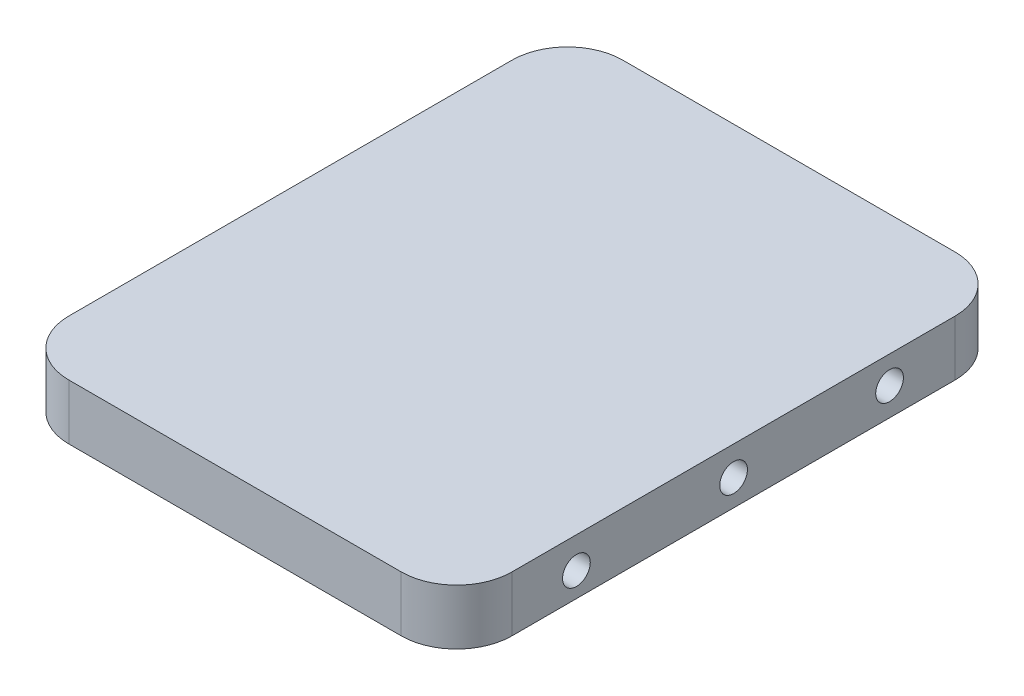
ISO-10303-21;
HEADER;
FILE_DESCRIPTION(('STEP AP214'),'2;1');
FILE_NAME('part.step','',(''),(''),'','','');
FILE_SCHEMA(('AUTOMOTIVE_DESIGN { 1 0 10303 214 1 1 1 1 }'));
ENDSEC;
DATA;
#1=APPLICATION_CONTEXT('core data for automotive mechanical design processes');
#2=APPLICATION_PROTOCOL_DEFINITION('international standard','automotive_design',2000,#1);
#3=PRODUCT_CONTEXT('',#1,'mechanical');
#4=PRODUCT('Part','Part','',(#3));
#5=PRODUCT_RELATED_PRODUCT_CATEGORY('part','',(#4));
#6=PRODUCT_DEFINITION_FORMATION('','',#4);
#7=PRODUCT_DEFINITION_CONTEXT('part definition',#1,'design');
#8=PRODUCT_DEFINITION('design','',#6,#7);
#9=PRODUCT_DEFINITION_SHAPE('','',#8);
#10=(LENGTH_UNIT() NAMED_UNIT(*) SI_UNIT(.MILLI.,.METRE.));
#11=(NAMED_UNIT(*) PLANE_ANGLE_UNIT() SI_UNIT($,.RADIAN.));
#12=(NAMED_UNIT(*) SI_UNIT($,.STERADIAN.) SOLID_ANGLE_UNIT());
#13=UNCERTAINTY_MEASURE_WITH_UNIT(LENGTH_MEASURE(1.E-05),#10,'distance_accuracy_value','');
#14=(GEOMETRIC_REPRESENTATION_CONTEXT(3) GLOBAL_UNCERTAINTY_ASSIGNED_CONTEXT((#13)) GLOBAL_UNIT_ASSIGNED_CONTEXT((#10,
#11,#12)) REPRESENTATION_CONTEXT('',''));
#15=CARTESIAN_POINT('',(0.,0.,0.));
#16=DIRECTION('',(0.,0.,1.));
#17=DIRECTION('',(1.,0.,0.));
#18=AXIS2_PLACEMENT_3D('',#15,#16,#17);
#19=CARTESIAN_POINT('',(-30.,10.,40.));
#20=DIRECTION('',(0.,-1.,0.));
#21=DIRECTION('',(0.,0.,-1.));
#22=AXIS2_PLACEMENT_3D('',#19,#20,#21);
#23=CYLINDRICAL_SURFACE('',#22,10.);
#24=CARTESIAN_POINT('',(-30.,0.,40.));
#25=DIRECTION('',(0.,1.,0.));
#26=DIRECTION('',(0.,0.,1.));
#27=AXIS2_PLACEMENT_3D('',#24,#25,#26);
#28=CIRCLE('',#27,10.);
#29=CARTESIAN_POINT('',(-40.,0.,39.9999999999999));
#30=VERTEX_POINT('',#29);
#31=CARTESIAN_POINT('',(-29.9999999999999,0.,50.));
#32=VERTEX_POINT('',#31);
#33=EDGE_CURVE('E135',#30,#32,#28,.T.);
#34=ORIENTED_EDGE('',*,*,#33,.T.);
#35=DIRECTION('',(0.,-1.,0.));
#36=VECTOR('',#35,1.);
#37=CARTESIAN_POINT('',(-29.9999999999999,10.,50.));
#38=LINE('',#37,#36);
#39=CARTESIAN_POINT('',(-29.9999999999999,10.,50.));
#40=VERTEX_POINT('',#39);
#41=EDGE_CURVE('E11',#40,#32,#38,.T.);
#42=ORIENTED_EDGE('',*,*,#41,.F.);
#43=CARTESIAN_POINT('',(-30.,10.,40.));
#44=DIRECTION('',(0.,1.,0.));
#45=DIRECTION('',(0.,0.,1.));
#46=AXIS2_PLACEMENT_3D('',#43,#44,#45);
#47=CIRCLE('',#46,10.);
#48=CARTESIAN_POINT('',(-40.,10.,39.9999999999999));
#49=VERTEX_POINT('',#48);
#50=EDGE_CURVE('E150',#49,#40,#47,.T.);
#51=ORIENTED_EDGE('',*,*,#50,.F.);
#52=DIRECTION('',(0.,-1.,0.));
#53=VECTOR('',#52,1.);
#54=CARTESIAN_POINT('',(-40.,10.,39.9999999999999));
#55=LINE('',#54,#53);
#56=EDGE_CURVE('E131',#49,#30,#55,.T.);
#57=ORIENTED_EDGE('',*,*,#56,.T.);
#58=EDGE_LOOP('',(#34,#42,#51,#57));
#59=FACE_BOUND('',#58,.T.);
#60=ADVANCED_FACE('F39',(#59),#23,.T.);
#61=CARTESIAN_POINT('',(-29.9999999999999,10.,50.));
#62=DIRECTION('',(0.,0.,-1.));
#63=DIRECTION('',(-1.,0.,0.));
#64=AXIS2_PLACEMENT_3D('',#61,#62,#63);
#65=PLANE('',#64);
#66=DIRECTION('',(1.,0.,0.));
#67=VECTOR('',#66,1.);
#68=CARTESIAN_POINT('',(-29.9999999999999,0.,50.));
#69=LINE('',#68,#67);
#70=CARTESIAN_POINT('',(29.9999999999999,0.,50.));
#71=VERTEX_POINT('',#70);
#72=EDGE_CURVE('E138',#32,#71,#69,.T.);
#73=ORIENTED_EDGE('',*,*,#72,.T.);
#74=DIRECTION('',(0.,-1.,0.));
#75=VECTOR('',#74,1.);
#76=CARTESIAN_POINT('',(29.9999999999999,10.,50.));
#77=LINE('',#76,#75);
#78=CARTESIAN_POINT('',(29.9999999999999,10.,50.));
#79=VERTEX_POINT('',#78);
#80=EDGE_CURVE('E47',#79,#71,#77,.T.);
#81=ORIENTED_EDGE('',*,*,#80,.F.);
#82=DIRECTION('',(1.,0.,0.));
#83=VECTOR('',#82,1.);
#84=CARTESIAN_POINT('',(-29.9999999999999,10.,50.));
#85=LINE('',#84,#83);
#86=EDGE_CURVE('E98',#40,#79,#85,.T.);
#87=ORIENTED_EDGE('',*,*,#86,.F.);
#88=ORIENTED_EDGE('',*,*,#41,.T.);
#89=EDGE_LOOP('',(#73,#81,#87,#88));
#90=FACE_BOUND('',#89,.T.);
#91=ADVANCED_FACE('F232',(#90),#65,.F.);
#92=CARTESIAN_POINT('',(30.,10.,40.));
#93=DIRECTION('',(0.,-1.,0.));
#94=DIRECTION('',(0.,0.,-1.));
#95=AXIS2_PLACEMENT_3D('',#92,#93,#94);
#96=CYLINDRICAL_SURFACE('',#95,10.);
#97=CARTESIAN_POINT('',(30.,0.,40.));
#98=DIRECTION('',(0.,1.,0.));
#99=DIRECTION('',(0.,0.,1.));
#100=AXIS2_PLACEMENT_3D('',#97,#98,#99);
#101=CIRCLE('',#100,10.);
#102=CARTESIAN_POINT('',(40.,0.,39.9999999999999));
#103=VERTEX_POINT('',#102);
#104=EDGE_CURVE('E141',#71,#103,#101,.T.);
#105=ORIENTED_EDGE('',*,*,#104,.T.);
#106=DIRECTION('',(0.,-1.,0.));
#107=VECTOR('',#106,1.);
#108=CARTESIAN_POINT('',(40.,10.,39.9999999999999));
#109=LINE('',#108,#107);
#110=CARTESIAN_POINT('',(40.,10.,39.9999999999999));
#111=VERTEX_POINT('',#110);
#112=EDGE_CURVE('E157',#111,#103,#109,.T.);
#113=ORIENTED_EDGE('',*,*,#112,.F.);
#114=CARTESIAN_POINT('',(30.,10.,40.));
#115=DIRECTION('',(0.,1.,0.));
#116=DIRECTION('',(0.,0.,1.));
#117=AXIS2_PLACEMENT_3D('',#114,#115,#116);
#118=CIRCLE('',#117,10.);
#119=EDGE_CURVE('E165',#79,#111,#118,.T.);
#120=ORIENTED_EDGE('',*,*,#119,.F.);
#121=ORIENTED_EDGE('',*,*,#80,.T.);
#122=EDGE_LOOP('',(#105,#113,#120,#121));
#123=FACE_BOUND('',#122,.T.);
#124=ADVANCED_FACE('F163',(#123),#96,.T.);
#125=CARTESIAN_POINT('',(40.,10.,-39.9999999999999));
#126=DIRECTION('',(-1.,0.,0.));
#127=DIRECTION('',(0.,0.,1.));
#128=AXIS2_PLACEMENT_3D('',#125,#126,#127);
#129=PLANE('',#128);
#130=CARTESIAN_POINT('',(40.,5.04202915432867,-28.1540073974384));
#131=DIRECTION('',(1.,0.,0.));
#132=DIRECTION('',(0.,0.,-1.));
#133=AXIS2_PLACEMENT_3D('',#130,#131,#132);
#134=CIRCLE('',#133,2.5);
#135=CARTESIAN_POINT('',(40.,5.04202915432867,-30.6540073974383));
#136=VERTEX_POINT('',#135);
#137=EDGE_CURVE('E195',#136,#136,#134,.T.);
#138=ORIENTED_EDGE('',*,*,#137,.F.);
#139=EDGE_LOOP('',(#138));
#140=FACE_BOUND('',#139,.T.);
#141=CARTESIAN_POINT('',(40.,4.40097856601223,28.371833373434));
#142=DIRECTION('',(1.,0.,0.));
#143=DIRECTION('',(0.,0.,-1.));
#144=AXIS2_PLACEMENT_3D('',#141,#142,#143);
#145=CIRCLE('',#144,2.5);
#146=CARTESIAN_POINT('',(40.,4.40097856601223,25.871833373434));
#147=VERTEX_POINT('',#146);
#148=EDGE_CURVE('E189',#147,#147,#145,.T.);
#149=ORIENTED_EDGE('',*,*,#148,.F.);
#150=EDGE_LOOP('',(#149));
#151=FACE_BOUND('',#150,.T.);
#152=CARTESIAN_POINT('',(40.,4.7437565714567,0.));
#153=DIRECTION('',(1.,0.,0.));
#154=DIRECTION('',(0.,0.,-1.));
#155=AXIS2_PLACEMENT_3D('',#152,#153,#154);
#156=CIRCLE('',#155,2.5);
#157=CARTESIAN_POINT('',(40.,4.7437565714567,-2.50000000000001));
#158=VERTEX_POINT('',#157);
#159=EDGE_CURVE('E183',#158,#158,#156,.T.);
#160=ORIENTED_EDGE('',*,*,#159,.F.);
#161=EDGE_LOOP('',(#160));
#162=FACE_BOUND('',#161,.T.);
#163=DIRECTION('',(0.,0.,-1.));
#164=VECTOR('',#163,1.);
#165=CARTESIAN_POINT('',(40.,0.,-39.9999999999999));
#166=LINE('',#165,#164);
#167=CARTESIAN_POINT('',(40.,0.,-39.9999999999999));
#168=VERTEX_POINT('',#167);
#169=EDGE_CURVE('E143',#103,#168,#166,.T.);
#170=ORIENTED_EDGE('',*,*,#169,.T.);
#171=DIRECTION('',(0.,-1.,0.));
#172=VECTOR('',#171,1.);
#173=CARTESIAN_POINT('',(40.,10.,-39.9999999999999));
#174=LINE('',#173,#172);
#175=CARTESIAN_POINT('',(40.,10.,-39.9999999999999));
#176=VERTEX_POINT('',#175);
#177=EDGE_CURVE('E154',#176,#168,#174,.T.);
#178=ORIENTED_EDGE('',*,*,#177,.F.);
#179=DIRECTION('',(0.,0.,-1.));
#180=VECTOR('',#179,1.);
#181=CARTESIAN_POINT('',(40.,10.,-39.9999999999999));
#182=LINE('',#181,#180);
#183=EDGE_CURVE('E177',#111,#176,#182,.T.);
#184=ORIENTED_EDGE('',*,*,#183,.F.);
#185=ORIENTED_EDGE('',*,*,#112,.T.);
#186=EDGE_LOOP('',(#170,#178,#184,#185));
#187=FACE_BOUND('',#186,.T.);
#188=ADVANCED_FACE('F173',(#140,#151,#162,#187),#129,.F.);
#189=CARTESIAN_POINT('',(30.,10.,-40.));
#190=DIRECTION('',(0.,-1.,0.));
#191=DIRECTION('',(0.,0.,-1.));
#192=AXIS2_PLACEMENT_3D('',#189,#190,#191);
#193=CYLINDRICAL_SURFACE('',#192,10.);
#194=CARTESIAN_POINT('',(30.,0.,-40.));
#195=DIRECTION('',(0.,1.,0.));
#196=DIRECTION('',(0.,0.,-1.));
#197=AXIS2_PLACEMENT_3D('',#194,#195,#196);
#198=CIRCLE('',#197,10.);
#199=CARTESIAN_POINT('',(29.9999999999999,0.,-50.));
#200=VERTEX_POINT('',#199);
#201=EDGE_CURVE('E145',#168,#200,#198,.T.);
#202=ORIENTED_EDGE('',*,*,#201,.T.);
#203=DIRECTION('',(0.,-1.,0.));
#204=VECTOR('',#203,1.);
#205=CARTESIAN_POINT('',(29.9999999999999,10.,-50.));
#206=LINE('',#205,#204);
#207=CARTESIAN_POINT('',(29.9999999999999,10.,-50.));
#208=VERTEX_POINT('',#207);
#209=EDGE_CURVE('E126',#208,#200,#206,.T.);
#210=ORIENTED_EDGE('',*,*,#209,.F.);
#211=CARTESIAN_POINT('',(30.,10.,-40.));
#212=DIRECTION('',(0.,1.,0.));
#213=DIRECTION('',(0.,0.,-1.));
#214=AXIS2_PLACEMENT_3D('',#211,#212,#213);
#215=CIRCLE('',#214,10.);
#216=EDGE_CURVE('E117',#176,#208,#215,.T.);
#217=ORIENTED_EDGE('',*,*,#216,.F.);
#218=ORIENTED_EDGE('',*,*,#177,.T.);
#219=EDGE_LOOP('',(#202,#210,#217,#218));
#220=FACE_BOUND('',#219,.T.);
#221=ADVANCED_FACE('F176',(#220),#193,.T.);
#222=CARTESIAN_POINT('',(-29.9999999999999,10.,-50.));
#223=DIRECTION('',(0.,0.,1.));
#224=DIRECTION('',(1.,0.,0.));
#225=AXIS2_PLACEMENT_3D('',#222,#223,#224);
#226=PLANE('',#225);
#227=DIRECTION('',(-1.,0.,0.));
#228=VECTOR('',#227,1.);
#229=CARTESIAN_POINT('',(-29.9999999999999,0.,-50.));
#230=LINE('',#229,#228);
#231=CARTESIAN_POINT('',(-29.9999999999999,0.,-50.));
#232=VERTEX_POINT('',#231);
#233=EDGE_CURVE('E125',#200,#232,#230,.T.);
#234=ORIENTED_EDGE('',*,*,#233,.T.);
#235=DIRECTION('',(0.,-1.,0.));
#236=VECTOR('',#235,1.);
#237=CARTESIAN_POINT('',(-29.9999999999999,10.,-50.));
#238=LINE('',#237,#236);
#239=CARTESIAN_POINT('',(-29.9999999999999,10.,-50.));
#240=VERTEX_POINT('',#239);
#241=EDGE_CURVE('E122',#240,#232,#238,.T.);
#242=ORIENTED_EDGE('',*,*,#241,.F.);
#243=DIRECTION('',(-1.,0.,0.));
#244=VECTOR('',#243,1.);
#245=CARTESIAN_POINT('',(-29.9999999999999,10.,-50.));
#246=LINE('',#245,#244);
#247=EDGE_CURVE('E111',#208,#240,#246,.T.);
#248=ORIENTED_EDGE('',*,*,#247,.F.);
#249=ORIENTED_EDGE('',*,*,#209,.T.);
#250=EDGE_LOOP('',(#234,#242,#248,#249));
#251=FACE_BOUND('',#250,.T.);
#252=ADVANCED_FACE('F123',(#251),#226,.F.);
#253=CARTESIAN_POINT('',(-30.,10.,-40.));
#254=DIRECTION('',(0.,-1.,0.));
#255=DIRECTION('',(0.,0.,-1.));
#256=AXIS2_PLACEMENT_3D('',#253,#254,#255);
#257=CYLINDRICAL_SURFACE('',#256,10.);
#258=CARTESIAN_POINT('',(-30.,0.,-40.));
#259=DIRECTION('',(0.,1.,0.));
#260=DIRECTION('',(0.,0.,1.));
#261=AXIS2_PLACEMENT_3D('',#258,#259,#260);
#262=CIRCLE('',#261,10.);
#263=CARTESIAN_POINT('',(-40.,0.,-39.9999999999999));
#264=VERTEX_POINT('',#263);
#265=EDGE_CURVE('E84',#232,#264,#262,.T.);
#266=ORIENTED_EDGE('',*,*,#265,.T.);
#267=DIRECTION('',(0.,-1.,0.));
#268=VECTOR('',#267,1.);
#269=CARTESIAN_POINT('',(-40.,10.,-39.9999999999999));
#270=LINE('',#269,#268);
#271=CARTESIAN_POINT('',(-40.,10.,-39.9999999999999));
#272=VERTEX_POINT('',#271);
#273=EDGE_CURVE('E127',#272,#264,#270,.T.);
#274=ORIENTED_EDGE('',*,*,#273,.F.);
#275=CARTESIAN_POINT('',(-30.,10.,-40.));
#276=DIRECTION('',(0.,1.,0.));
#277=DIRECTION('',(0.,0.,1.));
#278=AXIS2_PLACEMENT_3D('',#275,#276,#277);
#279=CIRCLE('',#278,10.);
#280=EDGE_CURVE('E115',#240,#272,#279,.T.);
#281=ORIENTED_EDGE('',*,*,#280,.F.);
#282=ORIENTED_EDGE('',*,*,#241,.T.);
#283=EDGE_LOOP('',(#266,#274,#281,#282));
#284=FACE_BOUND('',#283,.T.);
#285=ADVANCED_FACE('F129',(#284),#257,.T.);
#286=CARTESIAN_POINT('',(-40.,10.,-39.9999999999999));
#287=DIRECTION('',(1.,0.,0.));
#288=DIRECTION('',(0.,0.,-1.));
#289=AXIS2_PLACEMENT_3D('',#286,#287,#288);
#290=PLANE('',#289);
#291=CARTESIAN_POINT('',(-40.0000000000001,5.04202915432867,-28.1540073974383));
#292=DIRECTION('',(1.,0.,0.));
#293=DIRECTION('',(0.,0.,-1.));
#294=AXIS2_PLACEMENT_3D('',#291,#292,#293);
#295=CIRCLE('',#294,2.5);
#296=CARTESIAN_POINT('',(-40.0000000000001,5.04202915432867,-30.6540073974383));
#297=VERTEX_POINT('',#296);
#298=EDGE_CURVE('E192',#297,#297,#295,.T.);
#299=ORIENTED_EDGE('',*,*,#298,.T.);
#300=EDGE_LOOP('',(#299));
#301=FACE_BOUND('',#300,.T.);
#302=CARTESIAN_POINT('',(-40.,4.40097856601223,28.371833373434));
#303=DIRECTION('',(1.,0.,0.));
#304=DIRECTION('',(0.,0.,-1.));
#305=AXIS2_PLACEMENT_3D('',#302,#303,#304);
#306=CIRCLE('',#305,2.5);
#307=CARTESIAN_POINT('',(-40.,4.40097856601223,25.871833373434));
#308=VERTEX_POINT('',#307);
#309=EDGE_CURVE('E186',#308,#308,#306,.T.);
#310=ORIENTED_EDGE('',*,*,#309,.T.);
#311=EDGE_LOOP('',(#310));
#312=FACE_BOUND('',#311,.T.);
#313=CARTESIAN_POINT('',(-40.,4.7437565714567,0.));
#314=DIRECTION('',(1.,0.,0.));
#315=DIRECTION('',(0.,0.,-1.));
#316=AXIS2_PLACEMENT_3D('',#313,#314,#315);
#317=CIRCLE('',#316,2.5);
#318=CARTESIAN_POINT('',(-40.,4.7437565714567,-2.49999999999999));
#319=VERTEX_POINT('',#318);
#320=EDGE_CURVE('E139',#319,#319,#317,.T.);
#321=ORIENTED_EDGE('',*,*,#320,.T.);
#322=EDGE_LOOP('',(#321));
#323=FACE_BOUND('',#322,.T.);
#324=DIRECTION('',(0.,0.,1.));
#325=VECTOR('',#324,1.);
#326=CARTESIAN_POINT('',(-40.,0.,-39.9999999999999));
#327=LINE('',#326,#325);
#328=EDGE_CURVE('E90',#264,#30,#327,.T.);
#329=ORIENTED_EDGE('',*,*,#328,.T.);
#330=ORIENTED_EDGE('',*,*,#56,.F.);
#331=DIRECTION('',(0.,0.,1.));
#332=VECTOR('',#331,1.);
#333=CARTESIAN_POINT('',(-40.,10.,-39.9999999999999));
#334=LINE('',#333,#332);
#335=EDGE_CURVE('E55',#272,#49,#334,.T.);
#336=ORIENTED_EDGE('',*,*,#335,.F.);
#337=ORIENTED_EDGE('',*,*,#273,.T.);
#338=EDGE_LOOP('',(#329,#330,#336,#337));
#339=FACE_BOUND('',#338,.T.);
#340=ADVANCED_FACE('F201',(#301,#312,#323,#339),#290,.F.);
#341=CARTESIAN_POINT('',(-30.,10.,40.));
#342=DIRECTION('',(0.,1.,0.));
#343=DIRECTION('',(0.,0.,1.));
#344=AXIS2_PLACEMENT_3D('',#341,#342,#343);
#345=PLANE('',#344);
#346=ORIENTED_EDGE('',*,*,#50,.T.);
#347=ORIENTED_EDGE('',*,*,#86,.T.);
#348=ORIENTED_EDGE('',*,*,#119,.T.);
#349=ORIENTED_EDGE('',*,*,#183,.T.);
#350=ORIENTED_EDGE('',*,*,#216,.T.);
#351=ORIENTED_EDGE('',*,*,#247,.T.);
#352=ORIENTED_EDGE('',*,*,#280,.T.);
#353=ORIENTED_EDGE('',*,*,#335,.T.);
#354=EDGE_LOOP('',(#346,#347,#348,#349,#350,#351,#352,#353));
#355=FACE_BOUND('',#354,.T.);
#356=ADVANCED_FACE('F113',(#355),#345,.T.);
#357=CARTESIAN_POINT('',(-30.,0.,40.));
#358=DIRECTION('',(0.,1.,0.));
#359=DIRECTION('',(0.,0.,1.));
#360=AXIS2_PLACEMENT_3D('',#357,#358,#359);
#361=PLANE('',#360);
#362=ORIENTED_EDGE('',*,*,#33,.F.);
#363=ORIENTED_EDGE('',*,*,#328,.F.);
#364=ORIENTED_EDGE('',*,*,#265,.F.);
#365=ORIENTED_EDGE('',*,*,#233,.F.);
#366=ORIENTED_EDGE('',*,*,#201,.F.);
#367=ORIENTED_EDGE('',*,*,#169,.F.);
#368=ORIENTED_EDGE('',*,*,#104,.F.);
#369=ORIENTED_EDGE('',*,*,#72,.F.);
#370=EDGE_LOOP('',(#362,#363,#364,#365,#366,#367,#368,#369));
#371=FACE_BOUND('',#370,.T.);
#372=ADVANCED_FACE('F169',(#371),#361,.F.);
#373=CARTESIAN_POINT('',(-40.,4.7437565714567,0.));
#374=DIRECTION('',(1.,0.,0.));
#375=DIRECTION('',(0.,0.,-1.));
#376=AXIS2_PLACEMENT_3D('',#373,#374,#375);
#377=CYLINDRICAL_SURFACE('',#376,2.5);
#378=CARTESIAN_POINT('',(-40.,4.7437565714567,-2.49999999999999));
#379=CARTESIAN_POINT('',(-39.1666666666667,4.7437565714567,-2.49999999999999));
#380=CARTESIAN_POINT('',(-38.3333333333334,4.7437565714567,-2.49999999999999));
#381=CARTESIAN_POINT('',(-36.6666666666667,4.7437565714567,-2.49999999999999));
#382=CARTESIAN_POINT('',(-35.8333333333334,4.7437565714567,-2.49999999999999));
#383=CARTESIAN_POINT('',(-34.1666666666667,4.7437565714567,-2.49999999999999));
#384=CARTESIAN_POINT('',(-33.3333333333334,4.7437565714567,-2.49999999999999));
#385=CARTESIAN_POINT('',(-31.6666666666667,4.7437565714567,-2.49999999999999));
#386=CARTESIAN_POINT('',(-30.8333333333334,4.7437565714567,-2.49999999999999));
#387=CARTESIAN_POINT('',(-29.1666666666667,4.7437565714567,-2.49999999999999));
#388=CARTESIAN_POINT('',(-28.3333333333334,4.7437565714567,-2.49999999999999));
#389=CARTESIAN_POINT('',(-26.6666666666667,4.7437565714567,-2.49999999999999));
#390=CARTESIAN_POINT('',(-25.8333333333334,4.7437565714567,-2.49999999999999));
#391=CARTESIAN_POINT('',(-24.1666666666667,4.7437565714567,-2.49999999999999));
#392=CARTESIAN_POINT('',(-23.3333333333334,4.7437565714567,-2.49999999999999));
#393=CARTESIAN_POINT('',(-21.6666666666667,4.7437565714567,-2.49999999999999));
#394=CARTESIAN_POINT('',(-20.8333333333334,4.7437565714567,-2.49999999999999));
#395=CARTESIAN_POINT('',(-19.1666666666667,4.7437565714567,-2.5));
#396=CARTESIAN_POINT('',(-18.3333333333334,4.7437565714567,-2.5));
#397=CARTESIAN_POINT('',(-16.6666666666667,4.7437565714567,-2.5));
#398=CARTESIAN_POINT('',(-15.8333333333334,4.7437565714567,-2.5));
#399=CARTESIAN_POINT('',(-14.1666666666667,4.7437565714567,-2.5));
#400=CARTESIAN_POINT('',(-13.3333333333334,4.7437565714567,-2.5));
#401=CARTESIAN_POINT('',(-11.6666666666667,4.7437565714567,-2.5));
#402=CARTESIAN_POINT('',(-10.8333333333334,4.7437565714567,-2.5));
#403=CARTESIAN_POINT('',(-9.16666666666669,4.7437565714567,-2.5));
#404=CARTESIAN_POINT('',(-8.33333333333335,4.7437565714567,-2.5));
#405=CARTESIAN_POINT('',(-6.66666666666669,4.7437565714567,-2.5));
#406=CARTESIAN_POINT('',(-5.83333333333335,4.7437565714567,-2.5));
#407=CARTESIAN_POINT('',(-4.16666666666668,4.7437565714567,-2.5));
#408=CARTESIAN_POINT('',(-3.33333333333335,4.7437565714567,-2.5));
#409=CARTESIAN_POINT('',(-1.66666666666668,4.7437565714567,-2.5));
#410=CARTESIAN_POINT('',(-0.833333333333348,4.7437565714567,-2.5));
#411=CARTESIAN_POINT('',(0.83333333333332,4.7437565714567,-2.5));
#412=CARTESIAN_POINT('',(1.66666666666665,4.7437565714567,-2.5));
#413=CARTESIAN_POINT('',(3.33333333333332,4.7437565714567,-2.5));
#414=CARTESIAN_POINT('',(4.16666666666666,4.7437565714567,-2.5));
#415=CARTESIAN_POINT('',(5.83333333333333,4.7437565714567,-2.5));
#416=CARTESIAN_POINT('',(6.66666666666666,4.7437565714567,-2.5));
#417=CARTESIAN_POINT('',(8.33333333333333,4.7437565714567,-2.5));
#418=CARTESIAN_POINT('',(9.16666666666666,4.7437565714567,-2.5));
#419=CARTESIAN_POINT('',(10.8333333333333,4.7437565714567,-2.5));
#420=CARTESIAN_POINT('',(11.6666666666667,4.7437565714567,-2.5));
#421=CARTESIAN_POINT('',(13.3333333333333,4.7437565714567,-2.5));
#422=CARTESIAN_POINT('',(14.1666666666667,4.7437565714567,-2.5));
#423=CARTESIAN_POINT('',(15.8333333333333,4.7437565714567,-2.5));
#424=CARTESIAN_POINT('',(16.6666666666667,4.7437565714567,-2.5));
#425=CARTESIAN_POINT('',(18.3333333333333,4.7437565714567,-2.50000000000001));
#426=CARTESIAN_POINT('',(19.1666666666667,4.7437565714567,-2.50000000000001));
#427=CARTESIAN_POINT('',(20.8333333333333,4.7437565714567,-2.50000000000001));
#428=CARTESIAN_POINT('',(21.6666666666667,4.7437565714567,-2.50000000000001));
#429=CARTESIAN_POINT('',(23.3333333333333,4.7437565714567,-2.50000000000001));
#430=CARTESIAN_POINT('',(24.1666666666667,4.7437565714567,-2.50000000000001));
#431=CARTESIAN_POINT('',(25.8333333333333,4.7437565714567,-2.50000000000001));
#432=CARTESIAN_POINT('',(26.6666666666667,4.7437565714567,-2.50000000000001));
#433=CARTESIAN_POINT('',(28.3333333333333,4.7437565714567,-2.50000000000001));
#434=CARTESIAN_POINT('',(29.1666666666667,4.7437565714567,-2.50000000000001));
#435=CARTESIAN_POINT('',(30.8333333333333,4.7437565714567,-2.50000000000001));
#436=CARTESIAN_POINT('',(31.6666666666667,4.7437565714567,-2.50000000000001));
#437=CARTESIAN_POINT('',(33.3333333333333,4.7437565714567,-2.50000000000001));
#438=CARTESIAN_POINT('',(34.1666666666667,4.7437565714567,-2.50000000000001));
#439=CARTESIAN_POINT('',(35.8333333333333,4.7437565714567,-2.50000000000001));
#440=CARTESIAN_POINT('',(36.6666666666667,4.7437565714567,-2.50000000000001));
#441=CARTESIAN_POINT('',(38.3333333333333,4.7437565714567,-2.50000000000001));
#442=CARTESIAN_POINT('',(39.1666666666667,4.7437565714567,-2.50000000000001));
#443=CARTESIAN_POINT('',(40.,4.7437565714567,-2.50000000000001));
#444=B_SPLINE_CURVE_WITH_KNOTS('',3,(#378,#379,#380,#381,#382,#383,#384,#385,#386,#387,#388,
#389,#390,#391,#392,#393,#394,#395,#396,#397,#398,#399,#400,#401,#402,#403,#404,#405,#406,#407,
#408,#409,#410,#411,#412,#413,#414,#415,#416,#417,#418,#419,#420,#421,#422,#423,#424,#425,#426,
#427,#428,#429,#430,#431,#432,#433,#434,#435,#436,#437,#438,#439,#440,#441,#442,#443),
.UNSPECIFIED.,.F.,.F.,(4,2,2,2,2,2,2,2,2,2,2,2,2,2,2,2,2,2,2,2,2,2,2,2,2,2,2,2,2,2,2,2,4),(0.,
2.5,5.,7.5,10.,12.5,15.,17.5,20.,22.5,25.,27.5,30.,32.5,35.,37.5,40.,42.5,45.,47.5,50.,52.5,55.,
57.5,60.,62.5,65.,67.5,70.,72.5,75.,77.5,80.),.UNSPECIFIED.);
#445=EDGE_CURVE('BSEAM218',#319,#158,#444,.T.);
#446=ORIENTED_EDGE('',*,*,#320,.F.);
#447=ORIENTED_EDGE('',*,*,#159,.T.);
#448=ORIENTED_EDGE('',*,*,#445,.T.);
#449=ORIENTED_EDGE('',*,*,#445,.F.);
#450=EDGE_LOOP('',(#446,#448,#447,#449));
#451=FACE_BOUND('',#450,.T.);
#452=ADVANCED_FACE('F218',(#451),#377,.F.);
#453=CARTESIAN_POINT('',(-40.,4.40097856601223,28.371833373434));
#454=DIRECTION('',(1.,0.,0.));
#455=DIRECTION('',(0.,0.,-1.));
#456=AXIS2_PLACEMENT_3D('',#453,#454,#455);
#457=CYLINDRICAL_SURFACE('',#456,2.5);
#458=ORIENTED_EDGE('',*,*,#309,.F.);
#459=EDGE_LOOP('',(#458));
#460=FACE_BOUND('',#459,.T.);
#461=ORIENTED_EDGE('',*,*,#148,.T.);
#462=EDGE_LOOP('',(#461));
#463=FACE_BOUND('',#462,.T.);
#464=ADVANCED_FACE('F207',(#460,#463),#457,.F.);
#465=CARTESIAN_POINT('',(-40.0000000000001,5.04202915432867,-28.1540073974383));
#466=DIRECTION('',(1.,0.,0.));
#467=DIRECTION('',(0.,0.,-1.));
#468=AXIS2_PLACEMENT_3D('',#465,#466,#467);
#469=CYLINDRICAL_SURFACE('',#468,2.5);
#470=ORIENTED_EDGE('',*,*,#298,.F.);
#471=EDGE_LOOP('',(#470));
#472=FACE_BOUND('',#471,.T.);
#473=ORIENTED_EDGE('',*,*,#137,.T.);
#474=EDGE_LOOP('',(#473));
#475=FACE_BOUND('',#474,.T.);
#476=ADVANCED_FACE('F204',(#472,#475),#469,.F.);
#477=CLOSED_SHELL('',(#60,#91,#124,#188,#221,#252,#285,#340,#356,#372,#452,#464,#476));
#478=MANIFOLD_SOLID_BREP('B2',#477);
#479=ADVANCED_BREP_SHAPE_REPRESENTATION('',(#18,#478),#14);
#480=SHAPE_DEFINITION_REPRESENTATION(#9,#479);
ENDSEC;
END-ISO-10303-21;
